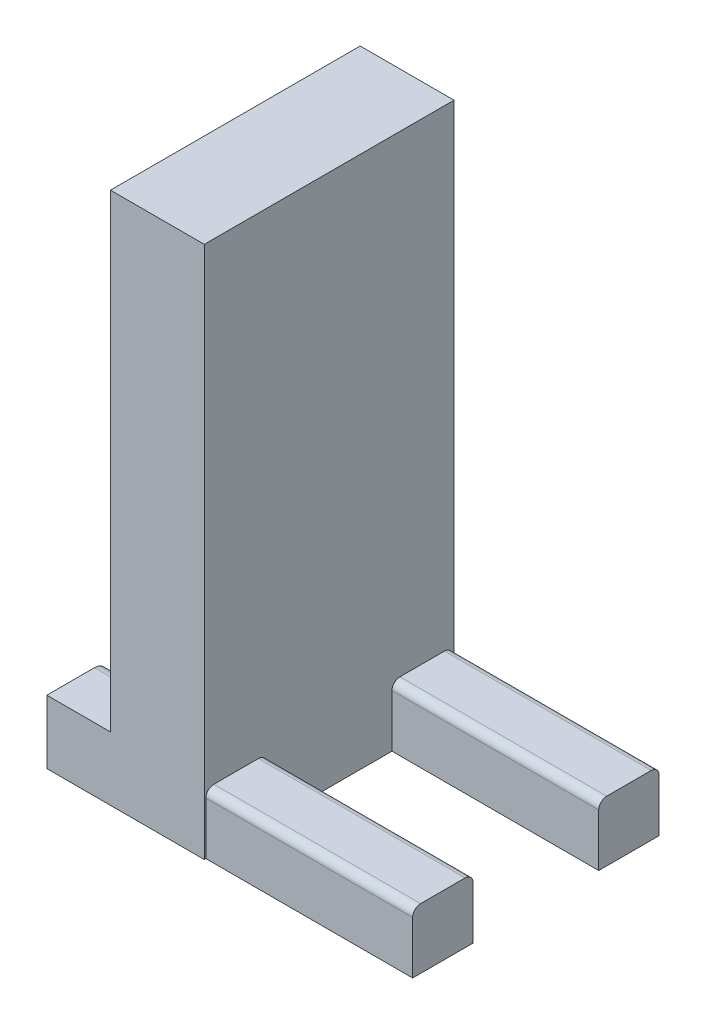
ISO-10303-21;
HEADER;
FILE_DESCRIPTION(('STEP AP214'),'2;1');
FILE_NAME('part.step','',(''),(''),'','','');
FILE_SCHEMA(('AUTOMOTIVE_DESIGN { 1 0 10303 214 1 1 1 1 }'));
ENDSEC;
DATA;
#1=APPLICATION_CONTEXT('core data for automotive mechanical design processes');
#2=APPLICATION_PROTOCOL_DEFINITION('international standard','automotive_design',2000,#1);
#3=PRODUCT_CONTEXT('',#1,'mechanical');
#4=PRODUCT('Part','Part','',(#3));
#5=PRODUCT_RELATED_PRODUCT_CATEGORY('part','',(#4));
#6=PRODUCT_DEFINITION_FORMATION('','',#4);
#7=PRODUCT_DEFINITION_CONTEXT('part definition',#1,'design');
#8=PRODUCT_DEFINITION('design','',#6,#7);
#9=PRODUCT_DEFINITION_SHAPE('','',#8);
#10=(LENGTH_UNIT() NAMED_UNIT(*) SI_UNIT(.MILLI.,.METRE.));
#11=(NAMED_UNIT(*) PLANE_ANGLE_UNIT() SI_UNIT($,.RADIAN.));
#12=(NAMED_UNIT(*) SI_UNIT($,.STERADIAN.) SOLID_ANGLE_UNIT());
#13=UNCERTAINTY_MEASURE_WITH_UNIT(LENGTH_MEASURE(1.E-05),#10,'distance_accuracy_value','');
#14=(GEOMETRIC_REPRESENTATION_CONTEXT(3) GLOBAL_UNCERTAINTY_ASSIGNED_CONTEXT((#13)) GLOBAL_UNIT_ASSIGNED_CONTEXT((#10,
#11,#12)) REPRESENTATION_CONTEXT('',''));
#15=CARTESIAN_POINT('',(0.,0.,0.));
#16=DIRECTION('',(0.,0.,1.));
#17=DIRECTION('',(1.,0.,0.));
#18=AXIS2_PLACEMENT_3D('',#15,#16,#17);
#19=CARTESIAN_POINT('',(-2.95,33.5,7.85000000000001));
#20=DIRECTION('',(1.,0.,0.));
#21=DIRECTION('',(0.,0.,-1.));
#22=AXIS2_PLACEMENT_3D('',#19,#20,#21);
#23=PLANE('',#22);
#24=DIRECTION('',(0.,0.,-1.));
#25=VECTOR('',#24,1.);
#26=CARTESIAN_POINT('',(-2.95,4.,4.05000000000001));
#27=LINE('',#26,#25);
#28=CARTESIAN_POINT('',(-2.95,4.,7.85000000000001));
#29=VERTEX_POINT('',#28);
#30=CARTESIAN_POINT('',(-2.95,4.,4.85000000000001));
#31=VERTEX_POINT('',#30);
#32=EDGE_CURVE('E463',#29,#31,#27,.T.);
#33=ORIENTED_EDGE('',*,*,#32,.F.);
#34=DIRECTION('',(0.,-1.,0.));
#35=VECTOR('',#34,1.);
#36=CARTESIAN_POINT('',(-2.95,33.5,7.85000000000001));
#37=LINE('',#36,#35);
#38=CARTESIAN_POINT('',(-2.95,33.5,7.85000000000001));
#39=VERTEX_POINT('',#38);
#40=EDGE_CURVE('E217',#39,#29,#37,.T.);
#41=ORIENTED_EDGE('',*,*,#40,.F.);
#42=DIRECTION('',(0.,0.,1.));
#43=VECTOR('',#42,1.);
#44=CARTESIAN_POINT('',(-2.95,33.5,7.85000000000001));
#45=LINE('',#44,#43);
#46=CARTESIAN_POINT('',(-2.95,33.5,-7.84999999999998));
#47=VERTEX_POINT('',#46);
#48=EDGE_CURVE('E298',#47,#39,#45,.T.);
#49=ORIENTED_EDGE('',*,*,#48,.F.);
#50=DIRECTION('',(0.,-1.,0.));
#51=VECTOR('',#50,1.);
#52=CARTESIAN_POINT('',(-2.95,33.5,-7.84999999999998));
#53=LINE('',#52,#51);
#54=CARTESIAN_POINT('',(-2.95,4.,-7.84999999999998));
#55=VERTEX_POINT('',#54);
#56=EDGE_CURVE('E308',#47,#55,#53,.T.);
#57=ORIENTED_EDGE('',*,*,#56,.T.);
#58=DIRECTION('',(0.,0.,-1.));
#59=VECTOR('',#58,1.);
#60=CARTESIAN_POINT('',(-2.95,4.,-7.84999999999998));
#61=LINE('',#60,#59);
#62=CARTESIAN_POINT('',(-2.95,4.,-4.84999999999998));
#63=VERTEX_POINT('',#62);
#64=EDGE_CURVE('E222',#63,#55,#61,.T.);
#65=ORIENTED_EDGE('',*,*,#64,.F.);
#66=CARTESIAN_POINT('',(-2.95,3.2,-4.84999999999998));
#67=DIRECTION('',(1.,0.,0.));
#68=DIRECTION('',(0.,0.,-1.));
#69=AXIS2_PLACEMENT_3D('',#66,#67,#68);
#70=CIRCLE('',#69,0.8);
#71=CARTESIAN_POINT('',(-2.95,3.2,-4.04999999999998));
#72=VERTEX_POINT('',#71);
#73=EDGE_CURVE('E343',#63,#72,#70,.T.);
#74=ORIENTED_EDGE('',*,*,#73,.T.);
#75=DIRECTION('',(0.,1.,0.));
#76=VECTOR('',#75,1.);
#77=CARTESIAN_POINT('',(-2.95,4.,-4.04999999999998));
#78=LINE('',#77,#76);
#79=CARTESIAN_POINT('',(-2.95,0.,-4.04999999999998));
#80=VERTEX_POINT('',#79);
#81=EDGE_CURVE('E218',#80,#72,#78,.T.);
#82=ORIENTED_EDGE('',*,*,#81,.F.);
#83=DIRECTION('',(0.,0.,1.));
#84=VECTOR('',#83,1.);
#85=CARTESIAN_POINT('',(-2.95,0.,7.85000000000001));
#86=LINE('',#85,#84);
#87=CARTESIAN_POINT('',(-2.95,0.,4.05000000000001));
#88=VERTEX_POINT('',#87);
#89=EDGE_CURVE('E295',#80,#88,#86,.T.);
#90=ORIENTED_EDGE('',*,*,#89,.T.);
#91=DIRECTION('',(0.,-1.,0.));
#92=VECTOR('',#91,1.);
#93=CARTESIAN_POINT('',(-2.95,4.,4.05000000000001));
#94=LINE('',#93,#92);
#95=CARTESIAN_POINT('',(-2.95,3.2,4.05000000000001));
#96=VERTEX_POINT('',#95);
#97=EDGE_CURVE('E212',#96,#88,#94,.T.);
#98=ORIENTED_EDGE('',*,*,#97,.F.);
#99=CARTESIAN_POINT('',(-2.95,3.2,4.85000000000001));
#100=DIRECTION('',(1.,0.,0.));
#101=DIRECTION('',(0.,0.,-1.));
#102=AXIS2_PLACEMENT_3D('',#99,#100,#101);
#103=CIRCLE('',#102,0.8);
#104=EDGE_CURVE('E341',#96,#31,#103,.T.);
#105=ORIENTED_EDGE('',*,*,#104,.T.);
#106=EDGE_LOOP('',(#33,#41,#49,#57,#65,#74,#82,#90,#98,#105));
#107=FACE_BOUND('',#106,.T.);
#108=ADVANCED_FACE('F32',(#107),#23,.F.);
#109=CARTESIAN_POINT('',(2.95,33.5,7.85000000000001));
#110=DIRECTION('',(-1.,0.,0.));
#111=DIRECTION('',(0.,0.,1.));
#112=AXIS2_PLACEMENT_3D('',#109,#110,#111);
#113=PLANE('',#112);
#114=DIRECTION('',(0.,-1.,0.));
#115=VECTOR('',#114,1.);
#116=CARTESIAN_POINT('',(2.95,3.8,-3.94999999999998));
#117=LINE('',#116,#115);
#118=CARTESIAN_POINT('',(2.95,3.3,-3.94999999999998));
#119=VERTEX_POINT('',#118);
#120=CARTESIAN_POINT('',(2.95,0.,-3.94999999999998));
#121=VERTEX_POINT('',#120);
#122=EDGE_CURVE('E245',#119,#121,#117,.T.);
#123=ORIENTED_EDGE('',*,*,#122,.F.);
#124=CARTESIAN_POINT('',(2.95,3.3,-4.44999999999998));
#125=DIRECTION('',(-1.,0.,0.));
#126=DIRECTION('',(0.,0.,1.));
#127=AXIS2_PLACEMENT_3D('',#124,#125,#126);
#128=CIRCLE('',#127,0.5);
#129=CARTESIAN_POINT('',(2.95,3.8,-4.44999999999998));
#130=VERTEX_POINT('',#129);
#131=EDGE_CURVE('E40',#119,#130,#128,.T.);
#132=ORIENTED_EDGE('',*,*,#131,.T.);
#133=DIRECTION('',(0.,0.,1.));
#134=VECTOR('',#133,1.);
#135=CARTESIAN_POINT('',(2.95,3.8,-7.74999999999998));
#136=LINE('',#135,#134);
#137=CARTESIAN_POINT('',(2.95,3.8,-7.24999999999998));
#138=VERTEX_POINT('',#137);
#139=EDGE_CURVE('E249',#138,#130,#136,.T.);
#140=ORIENTED_EDGE('',*,*,#139,.F.);
#141=CARTESIAN_POINT('',(2.95,3.3,-7.24999999999998));
#142=DIRECTION('',(-1.,0.,0.));
#143=DIRECTION('',(0.,0.,1.));
#144=AXIS2_PLACEMENT_3D('',#141,#142,#143);
#145=CIRCLE('',#144,0.5);
#146=CARTESIAN_POINT('',(2.95,3.3,-7.74999999999998));
#147=VERTEX_POINT('',#146);
#148=EDGE_CURVE('E11',#138,#147,#145,.T.);
#149=ORIENTED_EDGE('',*,*,#148,.T.);
#150=DIRECTION('',(0.,1.,0.));
#151=VECTOR('',#150,1.);
#152=CARTESIAN_POINT('',(2.95,3.8,-7.74999999999998));
#153=LINE('',#152,#151);
#154=CARTESIAN_POINT('',(2.95,0.,-7.74999999999998));
#155=VERTEX_POINT('',#154);
#156=EDGE_CURVE('E258',#155,#147,#153,.T.);
#157=ORIENTED_EDGE('',*,*,#156,.F.);
#158=DIRECTION('',(0.,0.,-1.));
#159=VECTOR('',#158,1.);
#160=CARTESIAN_POINT('',(2.95,0.,7.85000000000001));
#161=LINE('',#160,#159);
#162=CARTESIAN_POINT('',(2.95,0.,-7.84999999999997));
#163=VERTEX_POINT('',#162);
#164=EDGE_CURVE('E313',#155,#163,#161,.T.);
#165=ORIENTED_EDGE('',*,*,#164,.T.);
#166=DIRECTION('',(0.,-1.,0.));
#167=VECTOR('',#166,1.);
#168=CARTESIAN_POINT('',(2.95,33.5,-7.84999999999997));
#169=LINE('',#168,#167);
#170=CARTESIAN_POINT('',(2.95,33.5,-7.84999999999997));
#171=VERTEX_POINT('',#170);
#172=EDGE_CURVE('E321',#171,#163,#169,.T.);
#173=ORIENTED_EDGE('',*,*,#172,.F.);
#174=DIRECTION('',(0.,0.,-1.));
#175=VECTOR('',#174,1.);
#176=CARTESIAN_POINT('',(2.95,33.5,7.85000000000001));
#177=LINE('',#176,#175);
#178=CARTESIAN_POINT('',(2.95,33.5,7.85000000000001));
#179=VERTEX_POINT('',#178);
#180=EDGE_CURVE('E304',#179,#171,#177,.T.);
#181=ORIENTED_EDGE('',*,*,#180,.F.);
#182=DIRECTION('',(0.,-1.,0.));
#183=VECTOR('',#182,1.);
#184=CARTESIAN_POINT('',(2.95,33.5,7.85000000000001));
#185=LINE('',#184,#183);
#186=CARTESIAN_POINT('',(2.95,0.,7.85000000000001));
#187=VERTEX_POINT('',#186);
#188=EDGE_CURVE('E324',#179,#187,#185,.T.);
#189=ORIENTED_EDGE('',*,*,#188,.T.);
#190=CARTESIAN_POINT('',(2.95,0.,7.75));
#191=VERTEX_POINT('',#190);
#192=EDGE_CURVE('E314',#187,#191,#161,.T.);
#193=ORIENTED_EDGE('',*,*,#192,.T.);
#194=DIRECTION('',(0.,-1.,0.));
#195=VECTOR('',#194,1.);
#196=CARTESIAN_POINT('',(2.95,3.8,7.75));
#197=LINE('',#196,#195);
#198=CARTESIAN_POINT('',(2.95,3.3,7.75));
#199=VERTEX_POINT('',#198);
#200=EDGE_CURVE('E267',#199,#191,#197,.T.);
#201=ORIENTED_EDGE('',*,*,#200,.F.);
#202=CARTESIAN_POINT('',(2.95,3.3,7.25));
#203=DIRECTION('',(-1.,0.,0.));
#204=DIRECTION('',(0.,0.,1.));
#205=AXIS2_PLACEMENT_3D('',#202,#203,#204);
#206=CIRCLE('',#205,0.5);
#207=CARTESIAN_POINT('',(2.95,3.8,7.25));
#208=VERTEX_POINT('',#207);
#209=EDGE_CURVE('E372',#199,#208,#206,.T.);
#210=ORIENTED_EDGE('',*,*,#209,.T.);
#211=DIRECTION('',(0.,0.,1.));
#212=VECTOR('',#211,1.);
#213=CARTESIAN_POINT('',(2.95,3.8,3.95));
#214=LINE('',#213,#212);
#215=CARTESIAN_POINT('',(2.95,3.8,4.45));
#216=VERTEX_POINT('',#215);
#217=EDGE_CURVE('E271',#216,#208,#214,.T.);
#218=ORIENTED_EDGE('',*,*,#217,.F.);
#219=CARTESIAN_POINT('',(2.95,3.3,4.45));
#220=DIRECTION('',(-1.,0.,0.));
#221=DIRECTION('',(0.,0.,1.));
#222=AXIS2_PLACEMENT_3D('',#219,#220,#221);
#223=CIRCLE('',#222,0.5);
#224=CARTESIAN_POINT('',(2.95,3.3,3.95));
#225=VERTEX_POINT('',#224);
#226=EDGE_CURVE('E374',#216,#225,#223,.T.);
#227=ORIENTED_EDGE('',*,*,#226,.T.);
#228=DIRECTION('',(0.,1.,0.));
#229=VECTOR('',#228,1.);
#230=CARTESIAN_POINT('',(2.95,3.8,3.95));
#231=LINE('',#230,#229);
#232=CARTESIAN_POINT('',(2.95,0.,3.95));
#233=VERTEX_POINT('',#232);
#234=EDGE_CURVE('E281',#233,#225,#231,.T.);
#235=ORIENTED_EDGE('',*,*,#234,.F.);
#236=EDGE_CURVE('E317',#233,#121,#161,.T.);
#237=ORIENTED_EDGE('',*,*,#236,.T.);
#238=EDGE_LOOP('',(#123,#132,#140,#149,#157,#165,#173,#181,#189,#193,#201,#210,#218,#227,#235,#237));
#239=FACE_BOUND('',#238,.T.);
#240=ADVANCED_FACE('F376',(#239),#113,.F.);
#241=CARTESIAN_POINT('',(2.95,33.5,7.85000000000001));
#242=DIRECTION('',(0.,0.,-1.));
#243=DIRECTION('',(-1.,0.,0.));
#244=AXIS2_PLACEMENT_3D('',#241,#242,#243);
#245=PLANE('',#244);
#246=DIRECTION('',(1.,0.,0.));
#247=VECTOR('',#246,1.);
#248=CARTESIAN_POINT('',(2.95,0.,7.85000000000001));
#249=LINE('',#248,#247);
#250=CARTESIAN_POINT('',(-6.95,0.,7.85000000000001));
#251=VERTEX_POINT('',#250);
#252=EDGE_CURVE('E311',#251,#187,#249,.T.);
#253=ORIENTED_EDGE('',*,*,#252,.T.);
#254=ORIENTED_EDGE('',*,*,#188,.F.);
#255=DIRECTION('',(1.,0.,0.));
#256=VECTOR('',#255,1.);
#257=CARTESIAN_POINT('',(2.95,33.5,7.85000000000001));
#258=LINE('',#257,#256);
#259=EDGE_CURVE('E301',#39,#179,#258,.T.);
#260=ORIENTED_EDGE('',*,*,#259,.F.);
#261=ORIENTED_EDGE('',*,*,#40,.T.);
#262=DIRECTION('',(1.,0.,0.));
#263=VECTOR('',#262,1.);
#264=CARTESIAN_POINT('',(-6.95,4.,7.85000000000001));
#265=LINE('',#264,#263);
#266=CARTESIAN_POINT('',(-6.95,4.,7.85000000000001));
#267=VERTEX_POINT('',#266);
#268=EDGE_CURVE('E198',#267,#29,#265,.T.);
#269=ORIENTED_EDGE('',*,*,#268,.F.);
#270=DIRECTION('',(0.,1.,0.));
#271=VECTOR('',#270,1.);
#272=CARTESIAN_POINT('',(-6.95,4.,7.85000000000001));
#273=LINE('',#272,#271);
#274=EDGE_CURVE('E204',#251,#267,#273,.T.);
#275=ORIENTED_EDGE('',*,*,#274,.F.);
#276=EDGE_LOOP('',(#253,#254,#260,#261,#269,#275));
#277=FACE_BOUND('',#276,.T.);
#278=ADVANCED_FACE('F215',(#277),#245,.F.);
#279=CARTESIAN_POINT('',(2.95,33.5,-7.84999999999997));
#280=DIRECTION('',(0.,0.,1.));
#281=DIRECTION('',(1.,0.,0.));
#282=AXIS2_PLACEMENT_3D('',#279,#280,#281);
#283=PLANE('',#282);
#284=DIRECTION('',(-1.,0.,0.));
#285=VECTOR('',#284,1.);
#286=CARTESIAN_POINT('',(2.95,0.,-7.84999999999997));
#287=LINE('',#286,#285);
#288=CARTESIAN_POINT('',(-6.95,0.,-7.84999999999998));
#289=VERTEX_POINT('',#288);
#290=EDGE_CURVE('E302',#163,#289,#287,.T.);
#291=ORIENTED_EDGE('',*,*,#290,.T.);
#292=DIRECTION('',(0.,-1.,0.));
#293=VECTOR('',#292,1.);
#294=CARTESIAN_POINT('',(-6.95,4.,-7.84999999999998));
#295=LINE('',#294,#293);
#296=CARTESIAN_POINT('',(-6.95,4.,-7.84999999999998));
#297=VERTEX_POINT('',#296);
#298=EDGE_CURVE('E233',#297,#289,#295,.T.);
#299=ORIENTED_EDGE('',*,*,#298,.F.);
#300=DIRECTION('',(1.,0.,0.));
#301=VECTOR('',#300,1.);
#302=CARTESIAN_POINT('',(-6.95,4.,-7.84999999999998));
#303=LINE('',#302,#301);
#304=EDGE_CURVE('E242',#297,#55,#303,.T.);
#305=ORIENTED_EDGE('',*,*,#304,.T.);
#306=ORIENTED_EDGE('',*,*,#56,.F.);
#307=DIRECTION('',(-1.,0.,0.));
#308=VECTOR('',#307,1.);
#309=CARTESIAN_POINT('',(2.95,33.5,-7.84999999999997));
#310=LINE('',#309,#308);
#311=EDGE_CURVE('E306',#171,#47,#310,.T.);
#312=ORIENTED_EDGE('',*,*,#311,.F.);
#313=ORIENTED_EDGE('',*,*,#172,.T.);
#314=EDGE_LOOP('',(#291,#299,#305,#306,#312,#313));
#315=FACE_BOUND('',#314,.T.);
#316=ADVANCED_FACE('F489',(#315),#283,.F.);
#317=CARTESIAN_POINT('',(0.,33.5,0.));
#318=DIRECTION('',(0.,1.,0.));
#319=DIRECTION('',(0.,0.,1.));
#320=AXIS2_PLACEMENT_3D('',#317,#318,#319);
#321=PLANE('',#320);
#322=ORIENTED_EDGE('',*,*,#48,.T.);
#323=ORIENTED_EDGE('',*,*,#259,.T.);
#324=ORIENTED_EDGE('',*,*,#180,.T.);
#325=ORIENTED_EDGE('',*,*,#311,.T.);
#326=EDGE_LOOP('',(#322,#323,#324,#325));
#327=FACE_BOUND('',#326,.T.);
#328=ADVANCED_FACE('F518',(#327),#321,.T.);
#329=CARTESIAN_POINT('',(0.,0.,0.));
#330=DIRECTION('',(0.,1.,0.));
#331=DIRECTION('',(0.,0.,1.));
#332=AXIS2_PLACEMENT_3D('',#329,#330,#331);
#333=PLANE('',#332);
#334=CARTESIAN_POINT('',(0.,0.,0.));
#335=DIRECTION('',(0.,-1.,0.));
#336=DIRECTION('',(0.,0.,-1.));
#337=AXIS2_PLACEMENT_3D('',#334,#335,#336);
#338=CIRCLE('',#337,0.975);
#339=CARTESIAN_POINT('',(0.,0.,-0.975));
#340=VERTEX_POINT('',#339);
#341=EDGE_CURVE('E291',#340,#340,#338,.T.);
#342=ORIENTED_EDGE('',*,*,#341,.F.);
#343=EDGE_LOOP('',(#342));
#344=FACE_BOUND('',#343,.T.);
#345=ORIENTED_EDGE('',*,*,#89,.F.);
#346=DIRECTION('',(1.,0.,0.));
#347=VECTOR('',#346,1.);
#348=CARTESIAN_POINT('',(-6.95,0.,-4.04999999999998));
#349=LINE('',#348,#347);
#350=CARTESIAN_POINT('',(-6.95,0.,-4.04999999999998));
#351=VERTEX_POINT('',#350);
#352=EDGE_CURVE('E237',#351,#80,#349,.T.);
#353=ORIENTED_EDGE('',*,*,#352,.F.);
#354=DIRECTION('',(0.,0.,1.));
#355=VECTOR('',#354,1.);
#356=CARTESIAN_POINT('',(-6.95,0.,-7.84999999999998));
#357=LINE('',#356,#355);
#358=EDGE_CURVE('E236',#289,#351,#357,.T.);
#359=ORIENTED_EDGE('',*,*,#358,.F.);
#360=ORIENTED_EDGE('',*,*,#290,.F.);
#361=ORIENTED_EDGE('',*,*,#164,.F.);
#362=DIRECTION('',(-1.,0.,0.));
#363=VECTOR('',#362,1.);
#364=CARTESIAN_POINT('',(15.95,0.,-7.74999999999998));
#365=LINE('',#364,#363);
#366=CARTESIAN_POINT('',(15.95,0.,-7.74999999999998));
#367=VERTEX_POINT('',#366);
#368=EDGE_CURVE('E256',#367,#155,#365,.T.);
#369=ORIENTED_EDGE('',*,*,#368,.F.);
#370=DIRECTION('',(0.,0.,-1.));
#371=VECTOR('',#370,1.);
#372=CARTESIAN_POINT('',(15.95,0.,-7.74999999999998));
#373=LINE('',#372,#371);
#374=CARTESIAN_POINT('',(15.95,0.,-3.94999999999998));
#375=VERTEX_POINT('',#374);
#376=EDGE_CURVE('E248',#375,#367,#373,.T.);
#377=ORIENTED_EDGE('',*,*,#376,.F.);
#378=DIRECTION('',(-1.,0.,0.));
#379=VECTOR('',#378,1.);
#380=CARTESIAN_POINT('',(15.95,0.,-3.94999999999998));
#381=LINE('',#380,#379);
#382=EDGE_CURVE('E264',#375,#121,#381,.T.);
#383=ORIENTED_EDGE('',*,*,#382,.T.);
#384=ORIENTED_EDGE('',*,*,#236,.F.);
#385=DIRECTION('',(-1.,0.,0.));
#386=VECTOR('',#385,1.);
#387=CARTESIAN_POINT('',(15.95,0.,3.95));
#388=LINE('',#387,#386);
#389=CARTESIAN_POINT('',(15.95,0.,3.95));
#390=VERTEX_POINT('',#389);
#391=EDGE_CURVE('E279',#390,#233,#388,.T.);
#392=ORIENTED_EDGE('',*,*,#391,.F.);
#393=DIRECTION('',(0.,0.,-1.));
#394=VECTOR('',#393,1.);
#395=CARTESIAN_POINT('',(15.95,0.,3.95));
#396=LINE('',#395,#394);
#397=CARTESIAN_POINT('',(15.95,0.,7.75));
#398=VERTEX_POINT('',#397);
#399=EDGE_CURVE('E270',#398,#390,#396,.T.);
#400=ORIENTED_EDGE('',*,*,#399,.F.);
#401=DIRECTION('',(-1.,0.,0.));
#402=VECTOR('',#401,1.);
#403=CARTESIAN_POINT('',(15.95,0.,7.75));
#404=LINE('',#403,#402);
#405=EDGE_CURVE('E288',#398,#191,#404,.T.);
#406=ORIENTED_EDGE('',*,*,#405,.T.);
#407=ORIENTED_EDGE('',*,*,#192,.F.);
#408=ORIENTED_EDGE('',*,*,#252,.F.);
#409=DIRECTION('',(0.,0.,1.));
#410=VECTOR('',#409,1.);
#411=CARTESIAN_POINT('',(-6.95,0.,4.05000000000001));
#412=LINE('',#411,#410);
#413=CARTESIAN_POINT('',(-6.95,0.,4.05000000000001));
#414=VERTEX_POINT('',#413);
#415=EDGE_CURVE('E210',#414,#251,#412,.T.);
#416=ORIENTED_EDGE('',*,*,#415,.F.);
#417=DIRECTION('',(1.,0.,0.));
#418=VECTOR('',#417,1.);
#419=CARTESIAN_POINT('',(-6.95,0.,4.05000000000001));
#420=LINE('',#419,#418);
#421=EDGE_CURVE('E219',#414,#88,#420,.T.);
#422=ORIENTED_EDGE('',*,*,#421,.T.);
#423=EDGE_LOOP('',(#345,#353,#359,#360,#361,#369,#377,#383,#384,#392,#400,#406,#407,#408,#416,#422));
#424=FACE_BOUND('',#423,.T.);
#425=ADVANCED_FACE('F397',(#344,#424),#333,.F.);
#426=CARTESIAN_POINT('',(0.,10.,0.));
#427=DIRECTION('',(0.,-1.,0.));
#428=DIRECTION('',(0.,0.,-1.));
#429=AXIS2_PLACEMENT_3D('',#426,#427,#428);
#430=CYLINDRICAL_SURFACE('',#429,0.975);
#431=CARTESIAN_POINT('',(0.,10.,0.));
#432=DIRECTION('',(0.,-1.,0.));
#433=DIRECTION('',(0.,0.,-1.));
#434=AXIS2_PLACEMENT_3D('',#431,#432,#433);
#435=CIRCLE('',#434,0.975);
#436=CARTESIAN_POINT('',(0.,10.,-0.975));
#437=VERTEX_POINT('',#436);
#438=EDGE_CURVE('E292',#437,#437,#435,.T.);
#439=ORIENTED_EDGE('',*,*,#438,.F.);
#440=EDGE_LOOP('',(#439));
#441=FACE_BOUND('',#440,.T.);
#442=ORIENTED_EDGE('',*,*,#341,.T.);
#443=EDGE_LOOP('',(#442));
#444=FACE_BOUND('',#443,.T.);
#445=ADVANCED_FACE('F513',(#441,#444),#430,.F.);
#446=CARTESIAN_POINT('',(0.,10.,0.));
#447=DIRECTION('',(0.,-1.,0.));
#448=DIRECTION('',(0.,0.,-1.));
#449=AXIS2_PLACEMENT_3D('',#446,#447,#448);
#450=PLANE('',#449);
#451=ORIENTED_EDGE('',*,*,#438,.T.);
#452=EDGE_LOOP('',(#451));
#453=FACE_BOUND('',#452,.T.);
#454=ADVANCED_FACE('F510',(#453),#450,.T.);
#455=CARTESIAN_POINT('',(15.95,3.8,7.75));
#456=DIRECTION('',(0.,0.,-1.));
#457=DIRECTION('',(-1.,0.,0.));
#458=AXIS2_PLACEMENT_3D('',#455,#456,#457);
#459=PLANE('',#458);
#460=DIRECTION('',(0.,-1.,0.));
#461=VECTOR('',#460,1.);
#462=CARTESIAN_POINT('',(15.95,3.8,7.75));
#463=LINE('',#462,#461);
#464=CARTESIAN_POINT('',(15.95,3.3,7.75));
#465=VERTEX_POINT('',#464);
#466=EDGE_CURVE('E268',#465,#398,#463,.T.);
#467=ORIENTED_EDGE('',*,*,#466,.F.);
#468=DIRECTION('',(-1.,0.,0.));
#469=VECTOR('',#468,1.);
#470=CARTESIAN_POINT('',(15.95,3.3,7.75));
#471=LINE('',#470,#469);
#472=EDGE_CURVE('E345',#465,#199,#471,.T.);
#473=ORIENTED_EDGE('',*,*,#472,.T.);
#474=ORIENTED_EDGE('',*,*,#200,.T.);
#475=ORIENTED_EDGE('',*,*,#405,.F.);
#476=EDGE_LOOP('',(#467,#473,#474,#475));
#477=FACE_BOUND('',#476,.T.);
#478=ADVANCED_FACE('F451',(#477),#459,.F.);
#479=CARTESIAN_POINT('',(15.95,3.8,3.95));
#480=DIRECTION('',(0.,0.,1.));
#481=DIRECTION('',(1.,0.,0.));
#482=AXIS2_PLACEMENT_3D('',#479,#480,#481);
#483=PLANE('',#482);
#484=ORIENTED_EDGE('',*,*,#234,.T.);
#485=DIRECTION('',(-1.,0.,0.));
#486=VECTOR('',#485,1.);
#487=CARTESIAN_POINT('',(15.95,3.3,3.95));
#488=LINE('',#487,#486);
#489=CARTESIAN_POINT('',(15.95,3.3,3.95));
#490=VERTEX_POINT('',#489);
#491=EDGE_CURVE('E357',#225,#490,#488,.F.);
#492=ORIENTED_EDGE('',*,*,#491,.T.);
#493=DIRECTION('',(0.,1.,0.));
#494=VECTOR('',#493,1.);
#495=CARTESIAN_POINT('',(15.95,3.8,3.95));
#496=LINE('',#495,#494);
#497=EDGE_CURVE('E273',#390,#490,#496,.T.);
#498=ORIENTED_EDGE('',*,*,#497,.F.);
#499=ORIENTED_EDGE('',*,*,#391,.T.);
#500=EDGE_LOOP('',(#484,#492,#498,#499));
#501=FACE_BOUND('',#500,.T.);
#502=ADVANCED_FACE('F455',(#501),#483,.F.);
#503=CARTESIAN_POINT('',(15.95,3.8,3.95));
#504=DIRECTION('',(0.,-1.,0.));
#505=DIRECTION('',(0.,0.,-1.));
#506=AXIS2_PLACEMENT_3D('',#503,#504,#505);
#507=PLANE('',#506);
#508=ORIENTED_EDGE('',*,*,#217,.T.);
#509=DIRECTION('',(-1.,0.,0.));
#510=VECTOR('',#509,1.);
#511=CARTESIAN_POINT('',(15.95,3.8,7.25));
#512=LINE('',#511,#510);
#513=CARTESIAN_POINT('',(15.95,3.8,7.25));
#514=VERTEX_POINT('',#513);
#515=EDGE_CURVE('E351',#208,#514,#512,.F.);
#516=ORIENTED_EDGE('',*,*,#515,.T.);
#517=DIRECTION('',(0.,0.,1.));
#518=VECTOR('',#517,1.);
#519=CARTESIAN_POINT('',(15.95,3.8,3.95));
#520=LINE('',#519,#518);
#521=CARTESIAN_POINT('',(15.95,3.8,4.45));
#522=VERTEX_POINT('',#521);
#523=EDGE_CURVE('E276',#522,#514,#520,.T.);
#524=ORIENTED_EDGE('',*,*,#523,.F.);
#525=DIRECTION('',(-1.,0.,0.));
#526=VECTOR('',#525,1.);
#527=CARTESIAN_POINT('',(15.95,3.8,4.45));
#528=LINE('',#527,#526);
#529=EDGE_CURVE('E348',#522,#216,#528,.T.);
#530=ORIENTED_EDGE('',*,*,#529,.T.);
#531=EDGE_LOOP('',(#508,#516,#524,#530));
#532=FACE_BOUND('',#531,.T.);
#533=ADVANCED_FACE('F443',(#532),#507,.F.);
#534=CARTESIAN_POINT('',(15.95,0.,0.));
#535=DIRECTION('',(-1.,0.,0.));
#536=DIRECTION('',(0.,0.,1.));
#537=AXIS2_PLACEMENT_3D('',#534,#535,#536);
#538=PLANE('',#537);
#539=ORIENTED_EDGE('',*,*,#523,.T.);
#540=CARTESIAN_POINT('',(15.95,3.3,7.25));
#541=DIRECTION('',(-1.,0.,0.));
#542=DIRECTION('',(0.,0.,1.));
#543=AXIS2_PLACEMENT_3D('',#540,#541,#542);
#544=CIRCLE('',#543,0.5);
#545=EDGE_CURVE('E355',#514,#465,#544,.F.);
#546=ORIENTED_EDGE('',*,*,#545,.T.);
#547=ORIENTED_EDGE('',*,*,#466,.T.);
#548=ORIENTED_EDGE('',*,*,#399,.T.);
#549=ORIENTED_EDGE('',*,*,#497,.T.);
#550=CARTESIAN_POINT('',(15.95,3.3,4.45));
#551=DIRECTION('',(-1.,0.,0.));
#552=DIRECTION('',(0.,0.,1.));
#553=AXIS2_PLACEMENT_3D('',#550,#551,#552);
#554=CIRCLE('',#553,0.5);
#555=EDGE_CURVE('E353',#490,#522,#554,.F.);
#556=ORIENTED_EDGE('',*,*,#555,.T.);
#557=EDGE_LOOP('',(#539,#546,#547,#548,#549,#556));
#558=FACE_BOUND('',#557,.T.);
#559=ADVANCED_FACE('F439',(#558),#538,.F.);
#560=CARTESIAN_POINT('',(15.95,3.8,-3.94999999999998));
#561=DIRECTION('',(0.,0.,-1.));
#562=DIRECTION('',(0.,1.,0.));
#563=AXIS2_PLACEMENT_3D('',#560,#561,#562);
#564=PLANE('',#563);
#565=DIRECTION('',(0.,-1.,0.));
#566=VECTOR('',#565,1.);
#567=CARTESIAN_POINT('',(15.95,3.8,-3.94999999999998));
#568=LINE('',#567,#566);
#569=CARTESIAN_POINT('',(15.95,3.3,-3.94999999999998));
#570=VERTEX_POINT('',#569);
#571=EDGE_CURVE('E246',#570,#375,#568,.T.);
#572=ORIENTED_EDGE('',*,*,#571,.F.);
#573=DIRECTION('',(-1.,0.,0.));
#574=VECTOR('',#573,1.);
#575=CARTESIAN_POINT('',(15.95,3.3,-3.94999999999998));
#576=LINE('',#575,#574);
#577=EDGE_CURVE('E359',#570,#119,#576,.T.);
#578=ORIENTED_EDGE('',*,*,#577,.T.);
#579=ORIENTED_EDGE('',*,*,#122,.T.);
#580=ORIENTED_EDGE('',*,*,#382,.F.);
#581=EDGE_LOOP('',(#572,#578,#579,#580));
#582=FACE_BOUND('',#581,.T.);
#583=ADVANCED_FACE('F393',(#582),#564,.F.);
#584=CARTESIAN_POINT('',(15.95,3.8,-7.74999999999998));
#585=DIRECTION('',(0.,0.,1.));
#586=DIRECTION('',(0.,-1.,0.));
#587=AXIS2_PLACEMENT_3D('',#584,#585,#586);
#588=PLANE('',#587);
#589=ORIENTED_EDGE('',*,*,#156,.T.);
#590=DIRECTION('',(-1.,0.,0.));
#591=VECTOR('',#590,1.);
#592=CARTESIAN_POINT('',(15.95,3.3,-7.74999999999998));
#593=LINE('',#592,#591);
#594=CARTESIAN_POINT('',(15.95,3.3,-7.74999999999998));
#595=VERTEX_POINT('',#594);
#596=EDGE_CURVE('E52',#147,#595,#593,.F.);
#597=ORIENTED_EDGE('',*,*,#596,.T.);
#598=DIRECTION('',(0.,1.,0.));
#599=VECTOR('',#598,1.);
#600=CARTESIAN_POINT('',(15.95,3.8,-7.74999999999998));
#601=LINE('',#600,#599);
#602=EDGE_CURVE('E251',#367,#595,#601,.T.);
#603=ORIENTED_EDGE('',*,*,#602,.F.);
#604=ORIENTED_EDGE('',*,*,#368,.T.);
#605=EDGE_LOOP('',(#589,#597,#603,#604));
#606=FACE_BOUND('',#605,.T.);
#607=ADVANCED_FACE('F491',(#606),#588,.F.);
#608=CARTESIAN_POINT('',(15.95,3.8,-7.74999999999998));
#609=DIRECTION('',(0.,-1.,0.));
#610=DIRECTION('',(0.,0.,-1.));
#611=AXIS2_PLACEMENT_3D('',#608,#609,#610);
#612=PLANE('',#611);
#613=ORIENTED_EDGE('',*,*,#139,.T.);
#614=DIRECTION('',(-1.,0.,0.));
#615=VECTOR('',#614,1.);
#616=CARTESIAN_POINT('',(15.95,3.8,-4.44999999999998));
#617=LINE('',#616,#615);
#618=CARTESIAN_POINT('',(15.95,3.8,-4.44999999999998));
#619=VERTEX_POINT('',#618);
#620=EDGE_CURVE('E365',#130,#619,#617,.F.);
#621=ORIENTED_EDGE('',*,*,#620,.T.);
#622=DIRECTION('',(0.,0.,1.));
#623=VECTOR('',#622,1.);
#624=CARTESIAN_POINT('',(15.95,3.8,-7.74999999999998));
#625=LINE('',#624,#623);
#626=CARTESIAN_POINT('',(15.95,3.8,-7.24999999999998));
#627=VERTEX_POINT('',#626);
#628=EDGE_CURVE('E253',#627,#619,#625,.T.);
#629=ORIENTED_EDGE('',*,*,#628,.F.);
#630=DIRECTION('',(-1.,0.,0.));
#631=VECTOR('',#630,1.);
#632=CARTESIAN_POINT('',(15.95,3.8,-7.24999999999998));
#633=LINE('',#632,#631);
#634=EDGE_CURVE('E362',#627,#138,#633,.T.);
#635=ORIENTED_EDGE('',*,*,#634,.T.);
#636=EDGE_LOOP('',(#613,#621,#629,#635));
#637=FACE_BOUND('',#636,.T.);
#638=ADVANCED_FACE('F382',(#637),#612,.F.);
#639=CARTESIAN_POINT('',(15.95,0.,0.));
#640=DIRECTION('',(-1.,0.,0.));
#641=DIRECTION('',(0.,0.,1.));
#642=AXIS2_PLACEMENT_3D('',#639,#640,#641);
#643=PLANE('',#642);
#644=ORIENTED_EDGE('',*,*,#628,.T.);
#645=CARTESIAN_POINT('',(15.95,3.3,-4.44999999999998));
#646=DIRECTION('',(-1.,0.,0.));
#647=DIRECTION('',(0.,0.,1.));
#648=AXIS2_PLACEMENT_3D('',#645,#646,#647);
#649=CIRCLE('',#648,0.5);
#650=EDGE_CURVE('E369',#619,#570,#649,.F.);
#651=ORIENTED_EDGE('',*,*,#650,.T.);
#652=ORIENTED_EDGE('',*,*,#571,.T.);
#653=ORIENTED_EDGE('',*,*,#376,.T.);
#654=ORIENTED_EDGE('',*,*,#602,.T.);
#655=CARTESIAN_POINT('',(15.95,3.3,-7.24999999999998));
#656=DIRECTION('',(-1.,0.,0.));
#657=DIRECTION('',(0.,0.,1.));
#658=AXIS2_PLACEMENT_3D('',#655,#656,#657);
#659=CIRCLE('',#658,0.5);
#660=EDGE_CURVE('E367',#595,#627,#659,.F.);
#661=ORIENTED_EDGE('',*,*,#660,.T.);
#662=EDGE_LOOP('',(#644,#651,#652,#653,#654,#661));
#663=FACE_BOUND('',#662,.T.);
#664=ADVANCED_FACE('F389',(#663),#643,.F.);
#665=CARTESIAN_POINT('',(-6.95,4.,-4.04999999999998));
#666=DIRECTION('',(0.,0.,-1.));
#667=DIRECTION('',(-1.,0.,0.));
#668=AXIS2_PLACEMENT_3D('',#665,#666,#667);
#669=PLANE('',#668);
#670=ORIENTED_EDGE('',*,*,#81,.T.);
#671=DIRECTION('',(1.,0.,0.));
#672=VECTOR('',#671,1.);
#673=CARTESIAN_POINT('',(-6.95,3.2,-4.04999999999998));
#674=LINE('',#673,#672);
#675=CARTESIAN_POINT('',(-6.95,3.2,-4.04999999999998));
#676=VERTEX_POINT('',#675);
#677=EDGE_CURVE('E337',#72,#676,#674,.F.);
#678=ORIENTED_EDGE('',*,*,#677,.T.);
#679=DIRECTION('',(0.,1.,0.));
#680=VECTOR('',#679,1.);
#681=CARTESIAN_POINT('',(-6.95,4.,-4.04999999999998));
#682=LINE('',#681,#680);
#683=EDGE_CURVE('E228',#351,#676,#682,.T.);
#684=ORIENTED_EDGE('',*,*,#683,.F.);
#685=ORIENTED_EDGE('',*,*,#352,.T.);
#686=EDGE_LOOP('',(#670,#678,#684,#685));
#687=FACE_BOUND('',#686,.T.);
#688=ADVANCED_FACE('F473',(#687),#669,.F.);
#689=CARTESIAN_POINT('',(-6.95,4.,-7.84999999999998));
#690=DIRECTION('',(0.,-1.,0.));
#691=DIRECTION('',(0.,0.,-1.));
#692=AXIS2_PLACEMENT_3D('',#689,#690,#691);
#693=PLANE('',#692);
#694=DIRECTION('',(0.,0.,-1.));
#695=VECTOR('',#694,1.);
#696=CARTESIAN_POINT('',(-6.95,4.,-7.84999999999998));
#697=LINE('',#696,#695);
#698=CARTESIAN_POINT('',(-6.95,4.,-4.84999999999998));
#699=VERTEX_POINT('',#698);
#700=EDGE_CURVE('E231',#699,#297,#697,.T.);
#701=ORIENTED_EDGE('',*,*,#700,.F.);
#702=DIRECTION('',(1.,0.,0.));
#703=VECTOR('',#702,1.);
#704=CARTESIAN_POINT('',(-6.95,4.,-4.84999999999998));
#705=LINE('',#704,#703);
#706=EDGE_CURVE('E334',#699,#63,#705,.T.);
#707=ORIENTED_EDGE('',*,*,#706,.T.);
#708=ORIENTED_EDGE('',*,*,#64,.T.);
#709=ORIENTED_EDGE('',*,*,#304,.F.);
#710=EDGE_LOOP('',(#701,#707,#708,#709));
#711=FACE_BOUND('',#710,.T.);
#712=ADVANCED_FACE('F482',(#711),#693,.F.);
#713=CARTESIAN_POINT('',(-6.95,0.,0.));
#714=DIRECTION('',(-1.,0.,0.));
#715=DIRECTION('',(0.,0.,1.));
#716=AXIS2_PLACEMENT_3D('',#713,#714,#715);
#717=PLANE('',#716);
#718=ORIENTED_EDGE('',*,*,#683,.T.);
#719=CARTESIAN_POINT('',(-6.95,3.2,-4.84999999999998));
#720=DIRECTION('',(-1.,0.,0.));
#721=DIRECTION('',(0.,0.,1.));
#722=AXIS2_PLACEMENT_3D('',#719,#720,#721);
#723=CIRCLE('',#722,0.8);
#724=EDGE_CURVE('E339',#676,#699,#723,.T.);
#725=ORIENTED_EDGE('',*,*,#724,.T.);
#726=ORIENTED_EDGE('',*,*,#700,.T.);
#727=ORIENTED_EDGE('',*,*,#298,.T.);
#728=ORIENTED_EDGE('',*,*,#358,.T.);
#729=EDGE_LOOP('',(#718,#725,#726,#727,#728));
#730=FACE_BOUND('',#729,.T.);
#731=ADVANCED_FACE('F477',(#730),#717,.T.);
#732=CARTESIAN_POINT('',(-6.95,4.,4.05000000000001));
#733=DIRECTION('',(0.,-1.,0.));
#734=DIRECTION('',(0.,0.,-1.));
#735=AXIS2_PLACEMENT_3D('',#732,#733,#734);
#736=PLANE('',#735);
#737=ORIENTED_EDGE('',*,*,#32,.T.);
#738=DIRECTION('',(1.,0.,0.));
#739=VECTOR('',#738,1.);
#740=CARTESIAN_POINT('',(-6.95,4.,4.85000000000001));
#741=LINE('',#740,#739);
#742=CARTESIAN_POINT('',(-6.95,4.,4.85000000000001));
#743=VERTEX_POINT('',#742);
#744=EDGE_CURVE('E200',#31,#743,#741,.F.);
#745=ORIENTED_EDGE('',*,*,#744,.T.);
#746=DIRECTION('',(0.,0.,-1.));
#747=VECTOR('',#746,1.);
#748=CARTESIAN_POINT('',(-6.95,4.,4.05000000000001));
#749=LINE('',#748,#747);
#750=EDGE_CURVE('E193',#267,#743,#749,.T.);
#751=ORIENTED_EDGE('',*,*,#750,.F.);
#752=ORIENTED_EDGE('',*,*,#268,.T.);
#753=EDGE_LOOP('',(#737,#745,#751,#752));
#754=FACE_BOUND('',#753,.T.);
#755=ADVANCED_FACE('F196',(#754),#736,.F.);
#756=CARTESIAN_POINT('',(-6.95,4.,4.05000000000001));
#757=DIRECTION('',(0.,0.,1.));
#758=DIRECTION('',(0.,-1.,0.));
#759=AXIS2_PLACEMENT_3D('',#756,#757,#758);
#760=PLANE('',#759);
#761=DIRECTION('',(0.,-1.,0.));
#762=VECTOR('',#761,1.);
#763=CARTESIAN_POINT('',(-6.95,4.,4.05000000000001));
#764=LINE('',#763,#762);
#765=CARTESIAN_POINT('',(-6.95,3.2,4.05000000000001));
#766=VERTEX_POINT('',#765);
#767=EDGE_CURVE('E203',#766,#414,#764,.T.);
#768=ORIENTED_EDGE('',*,*,#767,.F.);
#769=DIRECTION('',(1.,0.,0.));
#770=VECTOR('',#769,1.);
#771=CARTESIAN_POINT('',(-6.95,3.2,4.05000000000001));
#772=LINE('',#771,#770);
#773=EDGE_CURVE('E328',#766,#96,#772,.T.);
#774=ORIENTED_EDGE('',*,*,#773,.T.);
#775=ORIENTED_EDGE('',*,*,#97,.T.);
#776=ORIENTED_EDGE('',*,*,#421,.F.);
#777=EDGE_LOOP('',(#768,#774,#775,#776));
#778=FACE_BOUND('',#777,.T.);
#779=ADVANCED_FACE('F467',(#778),#760,.F.);
#780=CARTESIAN_POINT('',(-6.95,0.,0.));
#781=DIRECTION('',(-1.,0.,0.));
#782=DIRECTION('',(0.,0.,1.));
#783=AXIS2_PLACEMENT_3D('',#780,#781,#782);
#784=PLANE('',#783);
#785=ORIENTED_EDGE('',*,*,#750,.T.);
#786=CARTESIAN_POINT('',(-6.95,3.2,4.85000000000001));
#787=DIRECTION('',(-1.,0.,0.));
#788=DIRECTION('',(0.,0.,1.));
#789=AXIS2_PLACEMENT_3D('',#786,#787,#788);
#790=CIRCLE('',#789,0.8);
#791=EDGE_CURVE('E332',#743,#766,#790,.T.);
#792=ORIENTED_EDGE('',*,*,#791,.T.);
#793=ORIENTED_EDGE('',*,*,#767,.T.);
#794=ORIENTED_EDGE('',*,*,#415,.T.);
#795=ORIENTED_EDGE('',*,*,#274,.T.);
#796=EDGE_LOOP('',(#785,#792,#793,#794,#795));
#797=FACE_BOUND('',#796,.T.);
#798=ADVANCED_FACE('F208',(#797),#784,.T.);
#799=CARTESIAN_POINT('',(-6.95,3.2,4.85000000000001));
#800=DIRECTION('',(1.,0.,0.));
#801=DIRECTION('',(0.,0.,-1.));
#802=AXIS2_PLACEMENT_3D('',#799,#800,#801);
#803=CYLINDRICAL_SURFACE('',#802,0.8);
#804=ORIENTED_EDGE('',*,*,#791,.F.);
#805=ORIENTED_EDGE('',*,*,#744,.F.);
#806=ORIENTED_EDGE('',*,*,#104,.F.);
#807=ORIENTED_EDGE('',*,*,#773,.F.);
#808=EDGE_LOOP('',(#804,#805,#806,#807));
#809=FACE_BOUND('',#808,.T.);
#810=ADVANCED_FACE('F418',(#809),#803,.T.);
#811=CARTESIAN_POINT('',(-6.95,3.2,-4.84999999999998));
#812=DIRECTION('',(1.,0.,0.));
#813=DIRECTION('',(0.,0.,-1.));
#814=AXIS2_PLACEMENT_3D('',#811,#812,#813);
#815=CYLINDRICAL_SURFACE('',#814,0.8);
#816=ORIENTED_EDGE('',*,*,#724,.F.);
#817=ORIENTED_EDGE('',*,*,#677,.F.);
#818=ORIENTED_EDGE('',*,*,#73,.F.);
#819=ORIENTED_EDGE('',*,*,#706,.F.);
#820=EDGE_LOOP('',(#816,#817,#818,#819));
#821=FACE_BOUND('',#820,.T.);
#822=ADVANCED_FACE('F421',(#821),#815,.T.);
#823=CARTESIAN_POINT('',(15.95,3.3,7.25));
#824=DIRECTION('',(-1.,0.,0.));
#825=DIRECTION('',(0.,0.,1.));
#826=AXIS2_PLACEMENT_3D('',#823,#824,#825);
#827=CYLINDRICAL_SURFACE('',#826,0.5);
#828=ORIENTED_EDGE('',*,*,#545,.F.);
#829=ORIENTED_EDGE('',*,*,#515,.F.);
#830=ORIENTED_EDGE('',*,*,#209,.F.);
#831=ORIENTED_EDGE('',*,*,#472,.F.);
#832=EDGE_LOOP('',(#828,#829,#830,#831));
#833=FACE_BOUND('',#832,.T.);
#834=ADVANCED_FACE('F425',(#833),#827,.T.);
#835=CARTESIAN_POINT('',(15.95,3.3,4.45));
#836=DIRECTION('',(-1.,0.,0.));
#837=DIRECTION('',(0.,0.,1.));
#838=AXIS2_PLACEMENT_3D('',#835,#836,#837);
#839=CYLINDRICAL_SURFACE('',#838,0.5);
#840=ORIENTED_EDGE('',*,*,#555,.F.);
#841=ORIENTED_EDGE('',*,*,#491,.F.);
#842=ORIENTED_EDGE('',*,*,#226,.F.);
#843=ORIENTED_EDGE('',*,*,#529,.F.);
#844=EDGE_LOOP('',(#840,#841,#842,#843));
#845=FACE_BOUND('',#844,.T.);
#846=ADVANCED_FACE('F406',(#845),#839,.T.);
#847=CARTESIAN_POINT('',(15.95,3.3,-4.44999999999998));
#848=DIRECTION('',(-1.,0.,0.));
#849=DIRECTION('',(0.,0.,1.));
#850=AXIS2_PLACEMENT_3D('',#847,#848,#849);
#851=CYLINDRICAL_SURFACE('',#850,0.5);
#852=ORIENTED_EDGE('',*,*,#650,.F.);
#853=ORIENTED_EDGE('',*,*,#620,.F.);
#854=ORIENTED_EDGE('',*,*,#131,.F.);
#855=ORIENTED_EDGE('',*,*,#577,.F.);
#856=EDGE_LOOP('',(#852,#853,#854,#855));
#857=FACE_BOUND('',#856,.T.);
#858=ADVANCED_FACE('F386',(#857),#851,.T.);
#859=CARTESIAN_POINT('',(15.95,3.3,-7.24999999999998));
#860=DIRECTION('',(-1.,0.,0.));
#861=DIRECTION('',(0.,0.,1.));
#862=AXIS2_PLACEMENT_3D('',#859,#860,#861);
#863=CYLINDRICAL_SURFACE('',#862,0.5);
#864=ORIENTED_EDGE('',*,*,#660,.F.);
#865=ORIENTED_EDGE('',*,*,#596,.F.);
#866=ORIENTED_EDGE('',*,*,#148,.F.);
#867=ORIENTED_EDGE('',*,*,#634,.F.);
#868=EDGE_LOOP('',(#864,#865,#866,#867));
#869=FACE_BOUND('',#868,.T.);
#870=ADVANCED_FACE('F34',(#869),#863,.T.);
#871=CLOSED_SHELL('',(#108,#240,#278,#316,#328,#425,#445,#454,#478,#502,#533,#559,#583,#607,
#638,#664,#688,#712,#731,#755,#779,#798,#810,#822,#834,#846,#858,#870));
#872=MANIFOLD_SOLID_BREP('B2',#871);
#873=ADVANCED_BREP_SHAPE_REPRESENTATION('',(#18,#872),#14);
#874=SHAPE_DEFINITION_REPRESENTATION(#9,#873);
ENDSEC;
END-ISO-10303-21;
